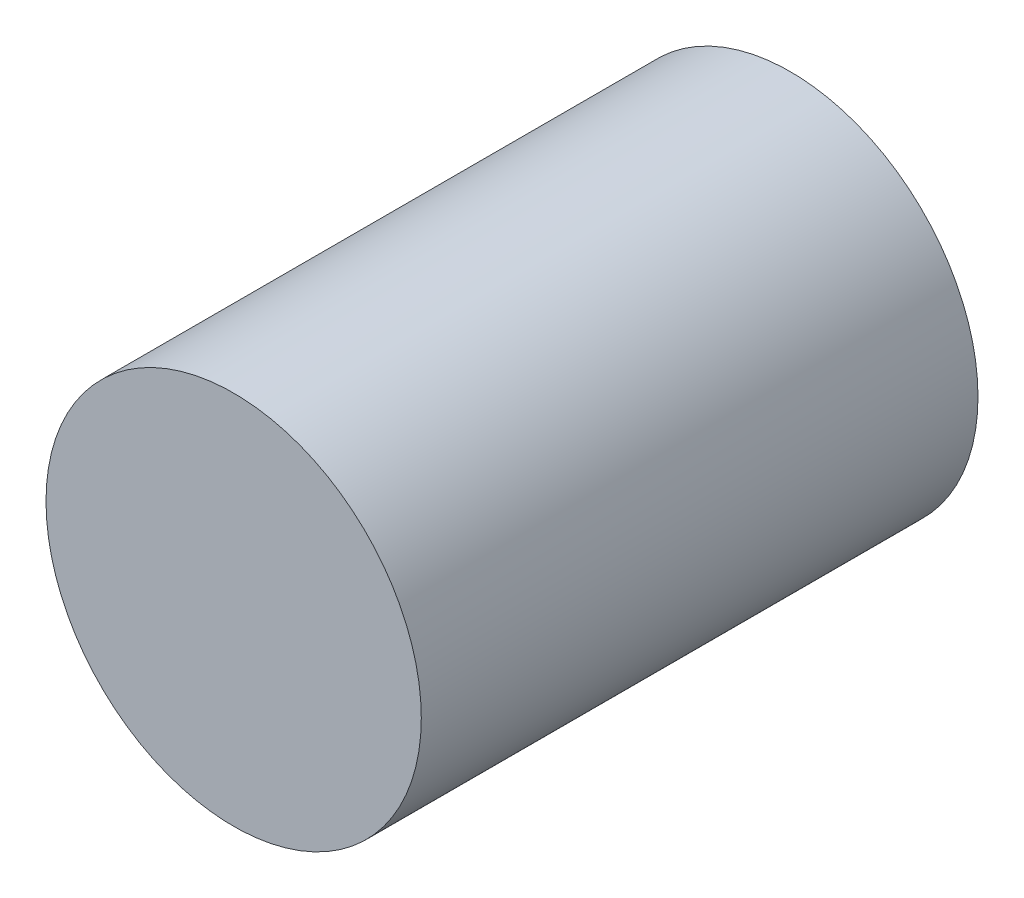
ISO-10303-21;
HEADER;
FILE_DESCRIPTION(('STEP AP214'),'2;1');
FILE_NAME('part.step','',(''),(''),'','','');
FILE_SCHEMA(('AUTOMOTIVE_DESIGN { 1 0 10303 214 1 1 1 1 }'));
ENDSEC;
DATA;
#1=APPLICATION_CONTEXT('core data for automotive mechanical design processes');
#2=APPLICATION_PROTOCOL_DEFINITION('international standard','automotive_design',2000,#1);
#3=PRODUCT_CONTEXT('',#1,'mechanical');
#4=PRODUCT('Part','Part','',(#3));
#5=PRODUCT_RELATED_PRODUCT_CATEGORY('part','',(#4));
#6=PRODUCT_DEFINITION_FORMATION('','',#4);
#7=PRODUCT_DEFINITION_CONTEXT('part definition',#1,'design');
#8=PRODUCT_DEFINITION('design','',#6,#7);
#9=PRODUCT_DEFINITION_SHAPE('','',#8);
#10=(LENGTH_UNIT() NAMED_UNIT(*) SI_UNIT(.MILLI.,.METRE.));
#11=(NAMED_UNIT(*) PLANE_ANGLE_UNIT() SI_UNIT($,.RADIAN.));
#12=(NAMED_UNIT(*) SI_UNIT($,.STERADIAN.) SOLID_ANGLE_UNIT());
#13=UNCERTAINTY_MEASURE_WITH_UNIT(LENGTH_MEASURE(1.E-05),#10,'distance_accuracy_value','');
#14=(GEOMETRIC_REPRESENTATION_CONTEXT(3) GLOBAL_UNCERTAINTY_ASSIGNED_CONTEXT((#13)) GLOBAL_UNIT_ASSIGNED_CONTEXT((#10,
#11,#12)) REPRESENTATION_CONTEXT('',''));
#15=CARTESIAN_POINT('',(0.,0.,0.));
#16=DIRECTION('',(0.,0.,1.));
#17=DIRECTION('',(1.,0.,0.));
#18=AXIS2_PLACEMENT_3D('',#15,#16,#17);
#19=CARTESIAN_POINT('',(0.,0.,-178.));
#20=DIRECTION('',(0.,0.,1.));
#21=DIRECTION('',(1.,0.,0.));
#22=AXIS2_PLACEMENT_3D('',#19,#20,#21);
#23=CYLINDRICAL_SURFACE('',#22,60.);
#24=CARTESIAN_POINT('',(0.,0.,-178.));
#25=DIRECTION('',(0.,0.,1.));
#26=DIRECTION('',(1.,0.,0.));
#27=AXIS2_PLACEMENT_3D('',#24,#25,#26);
#28=CIRCLE('',#27,60.);
#29=CARTESIAN_POINT('',(60.,0.,-178.));
#30=VERTEX_POINT('',#29);
#31=EDGE_CURVE('E10',#30,#30,#28,.T.);
#32=ORIENTED_EDGE('',*,*,#31,.T.);
#33=EDGE_LOOP('',(#32));
#34=FACE_BOUND('',#33,.T.);
#35=CARTESIAN_POINT('',(0.,0.,0.));
#36=DIRECTION('',(0.,0.,1.));
#37=DIRECTION('',(1.,0.,0.));
#38=AXIS2_PLACEMENT_3D('',#35,#36,#37);
#39=CIRCLE('',#38,60.);
#40=CARTESIAN_POINT('',(60.,0.,0.));
#41=VERTEX_POINT('',#40);
#42=EDGE_CURVE('E38',#41,#41,#39,.T.);
#43=ORIENTED_EDGE('',*,*,#42,.F.);
#44=EDGE_LOOP('',(#43));
#45=FACE_BOUND('',#44,.T.);
#46=ADVANCED_FACE('F35',(#34,#45),#23,.T.);
#47=CARTESIAN_POINT('',(0.,0.,-178.));
#48=DIRECTION('',(0.,0.,1.));
#49=DIRECTION('',(1.,0.,0.));
#50=AXIS2_PLACEMENT_3D('',#47,#48,#49);
#51=PLANE('',#50);
#52=ORIENTED_EDGE('',*,*,#31,.F.);
#53=EDGE_LOOP('',(#52));
#54=FACE_BOUND('',#53,.T.);
#55=ADVANCED_FACE('F50',(#54),#51,.F.);
#56=CARTESIAN_POINT('',(0.,0.,0.));
#57=DIRECTION('',(0.,0.,1.));
#58=DIRECTION('',(1.,0.,0.));
#59=AXIS2_PLACEMENT_3D('',#56,#57,#58);
#60=PLANE('',#59);
#61=ORIENTED_EDGE('',*,*,#42,.T.);
#62=EDGE_LOOP('',(#61));
#63=FACE_BOUND('',#62,.T.);
#64=ADVANCED_FACE('F47',(#63),#60,.T.);
#65=CLOSED_SHELL('',(#46,#55,#64));
#66=MANIFOLD_SOLID_BREP('B2',#65);
#67=ADVANCED_BREP_SHAPE_REPRESENTATION('',(#18,#66),#14);
#68=SHAPE_DEFINITION_REPRESENTATION(#9,#67);
ENDSEC;
END-ISO-10303-21;
